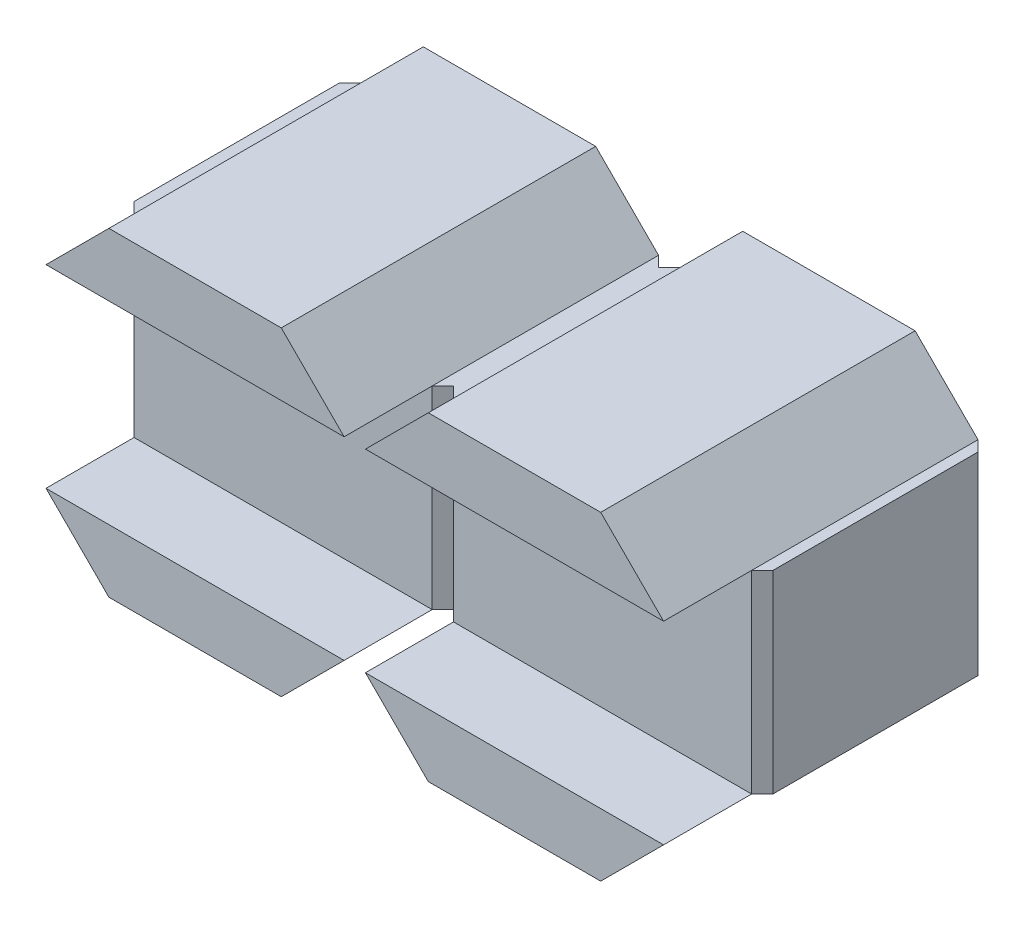
ISO-10303-21;
HEADER;
FILE_DESCRIPTION(('STEP AP214'),'2;1');
FILE_NAME('part.step','',(''),(''),'','','');
FILE_SCHEMA(('AUTOMOTIVE_DESIGN { 1 0 10303 214 1 1 1 1 }'));
ENDSEC;
DATA;
#1=APPLICATION_CONTEXT('core data for automotive mechanical design processes');
#2=APPLICATION_PROTOCOL_DEFINITION('international standard','automotive_design',2000,#1);
#3=PRODUCT_CONTEXT('',#1,'mechanical');
#4=PRODUCT('Part','Part','',(#3));
#5=PRODUCT_RELATED_PRODUCT_CATEGORY('part','',(#4));
#6=PRODUCT_DEFINITION_FORMATION('','',#4);
#7=PRODUCT_DEFINITION_CONTEXT('part definition',#1,'design');
#8=PRODUCT_DEFINITION('design','',#6,#7);
#9=PRODUCT_DEFINITION_SHAPE('','',#8);
#10=(LENGTH_UNIT() NAMED_UNIT(*) SI_UNIT(.MILLI.,.METRE.));
#11=(NAMED_UNIT(*) PLANE_ANGLE_UNIT() SI_UNIT($,.RADIAN.));
#12=(NAMED_UNIT(*) SI_UNIT($,.STERADIAN.) SOLID_ANGLE_UNIT());
#13=UNCERTAINTY_MEASURE_WITH_UNIT(LENGTH_MEASURE(1.E-05),#10,'distance_accuracy_value','');
#14=(GEOMETRIC_REPRESENTATION_CONTEXT(3) GLOBAL_UNCERTAINTY_ASSIGNED_CONTEXT((#13)) GLOBAL_UNIT_ASSIGNED_CONTEXT((#10,
#11,#12)) REPRESENTATION_CONTEXT('',''));
#15=CARTESIAN_POINT('',(0.,0.,0.));
#16=DIRECTION('',(0.,0.,1.));
#17=DIRECTION('',(1.,0.,0.));
#18=AXIS2_PLACEMENT_3D('',#15,#16,#17);
#19=CARTESIAN_POINT('',(-20.88535524301,12.424140161371,49.055899999998));
#20=DIRECTION('',(0.,-1.,0.));
#21=DIRECTION('',(0.,0.,-1.));
#22=AXIS2_PLACEMENT_3D('',#19,#20,#21);
#23=PLANE('',#22);
#24=DIRECTION('',(0.707106781307637,0.,0.707106781065458));
#25=VECTOR('',#24,1.);
#26=CARTESIAN_POINT('',(-20.88535524301,12.424140161371,47.255899999974));
#27=LINE('',#26,#25);
#28=CARTESIAN_POINT('',(-20.88535524301,12.424140161371,47.255899999987));
#29=VERTEX_POINT('',#28);
#30=CARTESIAN_POINT('',(-20.8006885763255,12.424140161371,47.3405666666285));
#31=VERTEX_POINT('',#30);
#32=EDGE_CURVE('E201',#29,#31,#27,.T.);
#33=ORIENTED_EDGE('',*,*,#32,.T.);
#34=DIRECTION('',(0.,0.,1.));
#35=VECTOR('',#34,1.);
#36=CARTESIAN_POINT('',(-20.80068857634,12.424140161371,48.155899999986));
#37=LINE('',#36,#35);
#38=CARTESIAN_POINT('',(-20.80068857634,12.424140161371,48.971233333344));
#39=VERTEX_POINT('',#38);
#40=EDGE_CURVE('E205',#31,#39,#37,.T.);
#41=ORIENTED_EDGE('',*,*,#40,.T.);
#42=DIRECTION('',(-0.707106781253365,0.,0.70710678111973));
#43=VECTOR('',#42,1.);
#44=CARTESIAN_POINT('',(-20.80068857634,12.424140161371,48.971233333344));
#45=LINE('',#44,#43);
#46=CARTESIAN_POINT('',(-20.885355243011,12.424140161371,49.055899999999));
#47=VERTEX_POINT('',#46);
#48=EDGE_CURVE('E21',#39,#47,#45,.T.);
#49=ORIENTED_EDGE('',*,*,#48,.T.);
#50=DIRECTION('',(0.,0.,1.));
#51=VECTOR('',#50,1.);
#52=CARTESIAN_POINT('',(-20.88535524301,12.424140161371,48.5059));
#53=LINE('',#52,#51);
#54=EDGE_CURVE('E418',#29,#47,#53,.T.);
#55=ORIENTED_EDGE('',*,*,#54,.F.);
#56=EDGE_LOOP('',(#33,#41,#49,#55));
#57=FACE_BOUND('',#56,.T.);
#58=ADVANCED_FACE('F17',(#57),#23,.T.);
#59=CARTESIAN_POINT('',(-21.38535524301,11.924140161371,49.7559));
#60=DIRECTION('',(0.70710678118655,-0.707106781186545,0.));
#61=DIRECTION('',(0.,0.,-1.));
#62=AXIS2_PLACEMENT_3D('',#59,#60,#61);
#63=PLANE('',#62);
#64=DIRECTION('',(0.707106781186545,0.70710678118655,0.));
#65=VECTOR('',#64,1.);
#66=CARTESIAN_POINT('',(-21.13535524301,12.174140161371,47.2559));
#67=LINE('',#66,#65);
#68=CARTESIAN_POINT('',(-21.38535524301,11.924140161371,47.2559));
#69=VERTEX_POINT('',#68);
#70=EDGE_CURVE('E221',#69,#29,#67,.T.);
#71=ORIENTED_EDGE('',*,*,#70,.T.);
#72=ORIENTED_EDGE('',*,*,#54,.T.);
#73=DIRECTION('',(0.,0.,1.));
#74=VECTOR('',#73,1.);
#75=CARTESIAN_POINT('',(-20.88535524301,12.424140161371,48.5059));
#76=LINE('',#75,#74);
#77=CARTESIAN_POINT('',(-20.88535524301,12.424140161371,49.7559));
#78=VERTEX_POINT('',#77);
#79=EDGE_CURVE('E214',#47,#78,#76,.T.);
#80=ORIENTED_EDGE('',*,*,#79,.T.);
#81=DIRECTION('',(-0.707106781186545,-0.70710678118655,0.));
#82=VECTOR('',#81,1.);
#83=CARTESIAN_POINT('',(-21.13535524301,12.174140161371,49.7559));
#84=LINE('',#83,#82);
#85=CARTESIAN_POINT('',(-21.38535524301,11.924140161371,49.7559));
#86=VERTEX_POINT('',#85);
#87=EDGE_CURVE('E217',#78,#86,#84,.T.);
#88=ORIENTED_EDGE('',*,*,#87,.T.);
#89=DIRECTION('',(0.,0.,1.));
#90=VECTOR('',#89,1.);
#91=CARTESIAN_POINT('',(-21.38535524301,11.924140161371,48.5059));
#92=LINE('',#91,#90);
#93=EDGE_CURVE('E290',#69,#86,#92,.T.);
#94=ORIENTED_EDGE('',*,*,#93,.F.);
#95=EDGE_LOOP('',(#71,#72,#80,#88,#94));
#96=FACE_BOUND('',#95,.T.);
#97=ADVANCED_FACE('F425',(#96),#63,.T.);
#98=CARTESIAN_POINT('',(-22.75602190967,11.924140161371,49.7559));
#99=DIRECTION('',(0.,-1.,0.));
#100=DIRECTION('',(0.,0.,-1.));
#101=AXIS2_PLACEMENT_3D('',#98,#99,#100);
#102=PLANE('',#101);
#103=DIRECTION('',(1.,0.,0.));
#104=VECTOR('',#103,1.);
#105=CARTESIAN_POINT('',(-22.07068857634,11.924140161371,47.2559));
#106=LINE('',#105,#104);
#107=CARTESIAN_POINT('',(-22.75602190967,11.924140161371,47.2559));
#108=VERTEX_POINT('',#107);
#109=EDGE_CURVE('E413',#108,#69,#106,.T.);
#110=ORIENTED_EDGE('',*,*,#109,.T.);
#111=ORIENTED_EDGE('',*,*,#93,.T.);
#112=DIRECTION('',(-1.,0.,0.));
#113=VECTOR('',#112,1.);
#114=CARTESIAN_POINT('',(-22.07068857634,11.924140161371,49.7559));
#115=LINE('',#114,#113);
#116=CARTESIAN_POINT('',(-22.75602190967,11.924140161371,49.7559));
#117=VERTEX_POINT('',#116);
#118=EDGE_CURVE('E416',#86,#117,#115,.T.);
#119=ORIENTED_EDGE('',*,*,#118,.T.);
#120=DIRECTION('',(0.,0.,1.));
#121=VECTOR('',#120,1.);
#122=CARTESIAN_POINT('',(-22.75602190967,11.924140161371,48.5059));
#123=LINE('',#122,#121);
#124=EDGE_CURVE('E277',#108,#117,#123,.T.);
#125=ORIENTED_EDGE('',*,*,#124,.F.);
#126=EDGE_LOOP('',(#110,#111,#119,#125));
#127=FACE_BOUND('',#126,.T.);
#128=ADVANCED_FACE('F521',(#127),#102,.T.);
#129=CARTESIAN_POINT('',(-22.75602190967,11.924140161371,47.2559));
#130=DIRECTION('',(-0.707106781186547,-0.707106781186547,0.));
#131=DIRECTION('',(0.,0.,1.));
#132=AXIS2_PLACEMENT_3D('',#129,#130,#131);
#133=PLANE('',#132);
#134=ORIENTED_EDGE('',*,*,#124,.T.);
#135=DIRECTION('',(-0.707106781186547,0.707106781186547,0.));
#136=VECTOR('',#135,1.);
#137=CARTESIAN_POINT('',(-23.00602190967,12.174140161371,49.7559));
#138=LINE('',#137,#136);
#139=CARTESIAN_POINT('',(-23.25602190967,12.424140161371,49.7559));
#140=VERTEX_POINT('',#139);
#141=EDGE_CURVE('E399',#117,#140,#138,.T.);
#142=ORIENTED_EDGE('',*,*,#141,.T.);
#143=DIRECTION('',(0.,0.,-1.));
#144=VECTOR('',#143,1.);
#145=CARTESIAN_POINT('',(-23.25602190967,12.424140161371,48.5059));
#146=LINE('',#145,#144);
#147=CARTESIAN_POINT('',(-23.25602190967,12.424140161371,49.0558999999998));
#148=VERTEX_POINT('',#147);
#149=EDGE_CURVE('E278',#140,#148,#146,.T.);
#150=ORIENTED_EDGE('',*,*,#149,.T.);
#151=DIRECTION('',(0.,0.,1.));
#152=VECTOR('',#151,1.);
#153=CARTESIAN_POINT('',(-23.25602190967,12.424140161371,48.155899999979));
#154=LINE('',#153,#152);
#155=CARTESIAN_POINT('',(-23.256021909695,12.424140161396,47.2558999999895));
#156=VERTEX_POINT('',#155);
#157=EDGE_CURVE('E265',#156,#148,#154,.T.);
#158=ORIENTED_EDGE('',*,*,#157,.F.);
#159=DIRECTION('',(0.707106781186547,-0.707106781186547,0.));
#160=VECTOR('',#159,1.);
#161=CARTESIAN_POINT('',(-23.00602190967,12.174140161371,47.2559));
#162=LINE('',#161,#160);
#163=EDGE_CURVE('E274',#156,#108,#162,.T.);
#164=ORIENTED_EDGE('',*,*,#163,.T.);
#165=EDGE_LOOP('',(#134,#142,#150,#158,#164));
#166=FACE_BOUND('',#165,.T.);
#167=ADVANCED_FACE('F513',(#166),#133,.T.);
#168=CARTESIAN_POINT('',(-25.88068857634,12.424140161371,49.0559));
#169=DIRECTION('',(0.,-1.,0.));
#170=DIRECTION('',(0.,0.,-1.));
#171=AXIS2_PLACEMENT_3D('',#168,#169,#170);
#172=PLANE('',#171);
#173=DIRECTION('',(0.70710678144543,0.,-0.707106780927665));
#174=VECTOR('',#173,1.);
#175=CARTESIAN_POINT('',(-25.88068857634,12.424140161371,47.340566666566));
#176=LINE('',#175,#174);
#177=CARTESIAN_POINT('',(-25.88068857634,12.424140161371,47.340566666566));
#178=VERTEX_POINT('',#177);
#179=CARTESIAN_POINT('',(-25.79602190967,12.424140161371,47.255899999979));
#180=VERTEX_POINT('',#179);
#181=EDGE_CURVE('E243',#178,#180,#176,.T.);
#182=ORIENTED_EDGE('',*,*,#181,.T.);
#183=DIRECTION('',(0.,0.,-1.));
#184=VECTOR('',#183,1.);
#185=CARTESIAN_POINT('',(-25.79602190967,12.424140161371,48.5059));
#186=LINE('',#185,#184);
#187=CARTESIAN_POINT('',(-25.79602190967,12.424140161371,49.0558999999998));
#188=VERTEX_POINT('',#187);
#189=EDGE_CURVE('E248',#188,#180,#186,.T.);
#190=ORIENTED_EDGE('',*,*,#189,.F.);
#191=DIRECTION('',(-0.707106781203252,0.,-0.707106781169843));
#192=VECTOR('',#191,1.);
#193=CARTESIAN_POINT('',(-25.79602190967,12.424140161371,49.0559));
#194=LINE('',#193,#192);
#195=CARTESIAN_POINT('',(-25.88068857634,12.424140161371,48.971233333334));
#196=VERTEX_POINT('',#195);
#197=EDGE_CURVE('E244',#188,#196,#194,.T.);
#198=ORIENTED_EDGE('',*,*,#197,.T.);
#199=DIRECTION('',(0.,0.,-1.));
#200=VECTOR('',#199,1.);
#201=CARTESIAN_POINT('',(-25.88068857634,12.424140161371,48.155899999979));
#202=LINE('',#201,#200);
#203=EDGE_CURVE('E240',#196,#178,#202,.T.);
#204=ORIENTED_EDGE('',*,*,#203,.T.);
#205=EDGE_LOOP('',(#182,#190,#198,#204));
#206=FACE_BOUND('',#205,.T.);
#207=ADVANCED_FACE('F529',(#206),#172,.T.);
#208=CARTESIAN_POINT('',(-23.42535524301,12.424140161371,49.0559));
#209=DIRECTION('',(0.,-1.,0.));
#210=DIRECTION('',(0.,0.,-1.));
#211=AXIS2_PLACEMENT_3D('',#208,#209,#210);
#212=PLANE('',#211);
#213=DIRECTION('',(0.707106781240819,0.,-0.707106781132276));
#214=VECTOR('',#213,1.);
#215=CARTESIAN_POINT('',(-23.34068857634,12.424140161371,47.340566666615));
#216=LINE('',#215,#214);
#217=CARTESIAN_POINT('',(-23.34068857634,12.424140161371,47.340566666615));
#218=VERTEX_POINT('',#217);
#219=EDGE_CURVE('E285',#218,#156,#216,.T.);
#220=ORIENTED_EDGE('',*,*,#219,.T.);
#221=ORIENTED_EDGE('',*,*,#157,.T.);
#222=DIRECTION('',(-0.707106781245049,0.,-0.707106781128046));
#223=VECTOR('',#222,1.);
#224=CARTESIAN_POINT('',(-23.25602190967,12.424140161371,49.0559));
#225=LINE('',#224,#223);
#226=CARTESIAN_POINT('',(-23.3406885763356,12.424140161371,48.9712333333409));
#227=VERTEX_POINT('',#226);
#228=EDGE_CURVE('E394',#148,#227,#225,.T.);
#229=ORIENTED_EDGE('',*,*,#228,.T.);
#230=DIRECTION('',(-0.707106781245035,0.,0.70710678112806));
#231=VECTOR('',#230,1.);
#232=CARTESIAN_POINT('',(-23.34068857634,12.424140161371,48.971233333344));
#233=LINE('',#232,#231);
#234=CARTESIAN_POINT('',(-23.42535524301,12.424140161371,49.0558999999995));
#235=VERTEX_POINT('',#234);
#236=EDGE_CURVE('E391',#227,#235,#233,.T.);
#237=ORIENTED_EDGE('',*,*,#236,.T.);
#238=DIRECTION('',(0.,0.,1.));
#239=VECTOR('',#238,1.);
#240=CARTESIAN_POINT('',(-23.42535524301,12.424140161371,48.5059));
#241=LINE('',#240,#239);
#242=CARTESIAN_POINT('',(-23.42535524301,12.424140161371,47.255899999979));
#243=VERTEX_POINT('',#242);
#244=EDGE_CURVE('E304',#243,#235,#241,.T.);
#245=ORIENTED_EDGE('',*,*,#244,.F.);
#246=DIRECTION('',(0.707106781240804,0.,0.707106781132291));
#247=VECTOR('',#246,1.);
#248=CARTESIAN_POINT('',(-23.42535524301,12.424140161371,47.255899999958));
#249=LINE('',#248,#247);
#250=EDGE_CURVE('E388',#243,#218,#249,.T.);
#251=ORIENTED_EDGE('',*,*,#250,.T.);
#252=EDGE_LOOP('',(#220,#221,#229,#237,#245,#251));
#253=FACE_BOUND('',#252,.T.);
#254=ADVANCED_FACE('F478',(#253),#212,.T.);
#255=CARTESIAN_POINT('',(-25.29602190967,11.924140161371,47.2559));
#256=DIRECTION('',(-0.707106781186547,-0.707106781186547,0.));
#257=DIRECTION('',(0.,0.,1.));
#258=AXIS2_PLACEMENT_3D('',#255,#256,#257);
#259=PLANE('',#258);
#260=DIRECTION('',(0.,0.,-1.));
#261=VECTOR('',#260,1.);
#262=CARTESIAN_POINT('',(-25.29602190967,11.924140161371,48.5059));
#263=LINE('',#262,#261);
#264=CARTESIAN_POINT('',(-25.29602190967,11.924140161371,49.7559));
#265=VERTEX_POINT('',#264);
#266=CARTESIAN_POINT('',(-25.29602190967,11.924140161371,47.2559));
#267=VERTEX_POINT('',#266);
#268=EDGE_CURVE('E307',#265,#267,#263,.T.);
#269=ORIENTED_EDGE('',*,*,#268,.F.);
#270=DIRECTION('',(-0.707106781186547,0.707106781186547,0.));
#271=VECTOR('',#270,1.);
#272=CARTESIAN_POINT('',(-25.54602190967,12.174140161371,49.7559));
#273=LINE('',#272,#271);
#274=CARTESIAN_POINT('',(-25.79602190967,12.424140161371,49.7559));
#275=VERTEX_POINT('',#274);
#276=EDGE_CURVE('E247',#265,#275,#273,.T.);
#277=ORIENTED_EDGE('',*,*,#276,.T.);
#278=DIRECTION('',(0.,0.,-1.));
#279=VECTOR('',#278,1.);
#280=CARTESIAN_POINT('',(-25.79602190967,12.424140161371,48.5059));
#281=LINE('',#280,#279);
#282=EDGE_CURVE('E254',#275,#188,#281,.T.);
#283=ORIENTED_EDGE('',*,*,#282,.T.);
#284=ORIENTED_EDGE('',*,*,#189,.T.);
#285=DIRECTION('',(0.707106781186547,-0.707106781186547,0.));
#286=VECTOR('',#285,1.);
#287=CARTESIAN_POINT('',(-25.54602190967,12.174140161371,47.2559));
#288=LINE('',#287,#286);
#289=EDGE_CURVE('E245',#180,#267,#288,.T.);
#290=ORIENTED_EDGE('',*,*,#289,.T.);
#291=EDGE_LOOP('',(#269,#277,#283,#284,#290));
#292=FACE_BOUND('',#291,.T.);
#293=ADVANCED_FACE('F471',(#292),#259,.T.);
#294=CARTESIAN_POINT('',(-23.92535524301,11.924140161371,49.7559));
#295=DIRECTION('',(0.707106781186547,-0.707106781186547,0.));
#296=DIRECTION('',(0.,0.,-1.));
#297=AXIS2_PLACEMENT_3D('',#294,#295,#296);
#298=PLANE('',#297);
#299=DIRECTION('',(0.707106781186547,0.707106781186547,0.));
#300=VECTOR('',#299,1.);
#301=CARTESIAN_POINT('',(-23.67535524301,12.174140161371,47.2559));
#302=LINE('',#301,#300);
#303=CARTESIAN_POINT('',(-23.92535524301,11.924140161371,47.2559));
#304=VERTEX_POINT('',#303);
#305=EDGE_CURVE('E308',#304,#243,#302,.T.);
#306=ORIENTED_EDGE('',*,*,#305,.T.);
#307=ORIENTED_EDGE('',*,*,#244,.T.);
#308=DIRECTION('',(0.,0.,1.));
#309=VECTOR('',#308,1.);
#310=CARTESIAN_POINT('',(-23.42535524301,12.424140161371,48.5059));
#311=LINE('',#310,#309);
#312=CARTESIAN_POINT('',(-23.42535524301,12.424140161371,49.7559));
#313=VERTEX_POINT('',#312);
#314=EDGE_CURVE('E295',#235,#313,#311,.T.);
#315=ORIENTED_EDGE('',*,*,#314,.T.);
#316=DIRECTION('',(-0.707106781186547,-0.707106781186547,0.));
#317=VECTOR('',#316,1.);
#318=CARTESIAN_POINT('',(-23.67535524301,12.174140161371,49.7559));
#319=LINE('',#318,#317);
#320=CARTESIAN_POINT('',(-23.92535524301,11.924140161371,49.7559));
#321=VERTEX_POINT('',#320);
#322=EDGE_CURVE('E298',#313,#321,#319,.T.);
#323=ORIENTED_EDGE('',*,*,#322,.T.);
#324=DIRECTION('',(0.,0.,1.));
#325=VECTOR('',#324,1.);
#326=CARTESIAN_POINT('',(-23.92535524301,11.924140161371,48.5059));
#327=LINE('',#326,#325);
#328=EDGE_CURVE('E385',#304,#321,#327,.T.);
#329=ORIENTED_EDGE('',*,*,#328,.F.);
#330=EDGE_LOOP('',(#306,#307,#315,#323,#329));
#331=FACE_BOUND('',#330,.T.);
#332=ADVANCED_FACE('F460',(#331),#298,.T.);
#333=CARTESIAN_POINT('',(-25.29602190967,11.924140161371,49.7559));
#334=DIRECTION('',(0.,-1.,0.));
#335=DIRECTION('',(0.,0.,-1.));
#336=AXIS2_PLACEMENT_3D('',#333,#334,#335);
#337=PLANE('',#336);
#338=DIRECTION('',(1.,0.,0.));
#339=VECTOR('',#338,1.);
#340=CARTESIAN_POINT('',(-24.61068857634,11.924140161371,47.2559));
#341=LINE('',#340,#339);
#342=EDGE_CURVE('E454',#267,#304,#341,.T.);
#343=ORIENTED_EDGE('',*,*,#342,.T.);
#344=ORIENTED_EDGE('',*,*,#328,.T.);
#345=DIRECTION('',(-1.,0.,0.));
#346=VECTOR('',#345,1.);
#347=CARTESIAN_POINT('',(-24.61068857634,11.924140161371,49.7559));
#348=LINE('',#347,#346);
#349=EDGE_CURVE('E326',#321,#265,#348,.T.);
#350=ORIENTED_EDGE('',*,*,#349,.T.);
#351=ORIENTED_EDGE('',*,*,#268,.T.);
#352=EDGE_LOOP('',(#343,#344,#350,#351));
#353=FACE_BOUND('',#352,.T.);
#354=ADVANCED_FACE('F465',(#353),#337,.T.);
#355=CARTESIAN_POINT('',(-23.42535524301,13.964140161371,49.7559));
#356=DIRECTION('',(0.,0.,-1.));
#357=DIRECTION('',(-1.,0.,0.));
#358=AXIS2_PLACEMENT_3D('',#355,#356,#357);
#359=PLANE('',#358);
#360=DIRECTION('',(-0.707106781186549,0.707106781186546,0.));
#361=VECTOR('',#360,1.);
#362=CARTESIAN_POINT('',(-23.42535524301,13.964140161371,49.7559));
#363=LINE('',#362,#361);
#364=CARTESIAN_POINT('',(-23.92535524301,14.464140161371,49.7559));
#365=VERTEX_POINT('',#364);
#366=CARTESIAN_POINT('',(-23.42535524301,13.964140161371,49.7559));
#367=VERTEX_POINT('',#366);
#368=EDGE_CURVE('E316',#365,#367,#363,.F.);
#369=ORIENTED_EDGE('',*,*,#368,.F.);
#370=DIRECTION('',(1.,0.,0.));
#371=VECTOR('',#370,1.);
#372=CARTESIAN_POINT('',(-24.61068857634,14.464140161371,49.7559));
#373=LINE('',#372,#371);
#374=CARTESIAN_POINT('',(-25.29602190967,14.464140161371,49.7559));
#375=VERTEX_POINT('',#374);
#376=EDGE_CURVE('E314',#375,#365,#373,.T.);
#377=ORIENTED_EDGE('',*,*,#376,.F.);
#378=DIRECTION('',(0.707106781186549,0.707106781186546,0.));
#379=VECTOR('',#378,1.);
#380=CARTESIAN_POINT('',(-25.79602190967,13.964140161371,49.7559));
#381=LINE('',#380,#379);
#382=CARTESIAN_POINT('',(-25.79602190967,13.964140161371,49.7559));
#383=VERTEX_POINT('',#382);
#384=EDGE_CURVE('E317',#383,#375,#381,.T.);
#385=ORIENTED_EDGE('',*,*,#384,.F.);
#386=DIRECTION('',(-1.,0.,0.));
#387=VECTOR('',#386,1.);
#388=CARTESIAN_POINT('',(-24.61068857634,13.964140161371,49.7559));
#389=LINE('',#388,#387);
#390=EDGE_CURVE('E319',#367,#383,#389,.T.);
#391=ORIENTED_EDGE('',*,*,#390,.F.);
#392=EDGE_LOOP('',(#369,#377,#385,#391));
#393=FACE_BOUND('',#392,.T.);
#394=ADVANCED_FACE('F619',(#393),#359,.F.);
#395=CARTESIAN_POINT('',(-23.42535524301,11.924140161371,49.7559));
#396=DIRECTION('',(0.,0.,-1.));
#397=DIRECTION('',(-1.,0.,0.));
#398=AXIS2_PLACEMENT_3D('',#395,#396,#397);
#399=PLANE('',#398);
#400=ORIENTED_EDGE('',*,*,#276,.F.);
#401=ORIENTED_EDGE('',*,*,#349,.F.);
#402=ORIENTED_EDGE('',*,*,#322,.F.);
#403=DIRECTION('',(-1.,0.,0.));
#404=VECTOR('',#403,1.);
#405=CARTESIAN_POINT('',(-24.61068857634,12.424140161371,49.7559));
#406=LINE('',#405,#404);
#407=EDGE_CURVE('E328',#313,#275,#406,.T.);
#408=ORIENTED_EDGE('',*,*,#407,.T.);
#409=EDGE_LOOP('',(#400,#401,#402,#408));
#410=FACE_BOUND('',#409,.T.);
#411=ADVANCED_FACE('F467',(#410),#399,.F.);
#412=CARTESIAN_POINT('',(-25.79602190967,13.964140161371,49.7559));
#413=DIRECTION('',(0.,-1.,0.));
#414=DIRECTION('',(0.,0.,-1.));
#415=AXIS2_PLACEMENT_3D('',#412,#413,#414);
#416=PLANE('',#415);
#417=DIRECTION('',(0.,0.,-1.));
#418=VECTOR('',#417,1.);
#419=CARTESIAN_POINT('',(-25.79602190967,13.964140161371,49.4058999999995));
#420=LINE('',#419,#418);
#421=CARTESIAN_POINT('',(-25.79602190967,13.964140161371,49.0558999999998));
#422=VERTEX_POINT('',#421);
#423=EDGE_CURVE('E322',#383,#422,#420,.T.);
#424=ORIENTED_EDGE('',*,*,#423,.T.);
#425=DIRECTION('',(1.,0.,0.));
#426=VECTOR('',#425,1.);
#427=CARTESIAN_POINT('',(-24.61068857634,13.964140161371,49.0559));
#428=LINE('',#427,#426);
#429=CARTESIAN_POINT('',(-23.42535524301,13.964140161371,49.0558999999994));
#430=VERTEX_POINT('',#429);
#431=EDGE_CURVE('E262',#422,#430,#428,.T.);
#432=ORIENTED_EDGE('',*,*,#431,.T.);
#433=DIRECTION('',(0.,0.,1.));
#434=VECTOR('',#433,1.);
#435=CARTESIAN_POINT('',(-23.42535524301,13.964140161371,49.4058999999995));
#436=LINE('',#435,#434);
#437=EDGE_CURVE('E323',#430,#367,#436,.T.);
#438=ORIENTED_EDGE('',*,*,#437,.T.);
#439=ORIENTED_EDGE('',*,*,#390,.T.);
#440=EDGE_LOOP('',(#424,#432,#438,#439));
#441=FACE_BOUND('',#440,.T.);
#442=ADVANCED_FACE('F612',(#441),#416,.T.);
#443=CARTESIAN_POINT('',(-25.79602190967,12.424140161371,49.7559));
#444=DIRECTION('',(0.,-1.,0.));
#445=DIRECTION('',(0.,0.,-1.));
#446=AXIS2_PLACEMENT_3D('',#443,#444,#445);
#447=PLANE('',#446);
#448=DIRECTION('',(-1.,0.,0.));
#449=VECTOR('',#448,1.);
#450=CARTESIAN_POINT('',(-24.61068857634,12.424140161371,49.0559));
#451=LINE('',#450,#449);
#452=EDGE_CURVE('E259',#235,#188,#451,.T.);
#453=ORIENTED_EDGE('',*,*,#452,.T.);
#454=ORIENTED_EDGE('',*,*,#282,.F.);
#455=ORIENTED_EDGE('',*,*,#407,.F.);
#456=ORIENTED_EDGE('',*,*,#314,.F.);
#457=EDGE_LOOP('',(#453,#454,#455,#456));
#458=FACE_BOUND('',#457,.T.);
#459=ADVANCED_FACE('F608',(#458),#447,.F.);
#460=CARTESIAN_POINT('',(-23.42535524301,12.424140161371,49.0559));
#461=DIRECTION('',(0.,0.,-1.));
#462=DIRECTION('',(-1.,0.,0.));
#463=AXIS2_PLACEMENT_3D('',#460,#461,#462);
#464=PLANE('',#463);
#465=ORIENTED_EDGE('',*,*,#452,.F.);
#466=DIRECTION('',(0.,1.,0.));
#467=VECTOR('',#466,1.);
#468=CARTESIAN_POINT('',(-23.42535524301,13.194140161371,49.0559));
#469=LINE('',#468,#467);
#470=EDGE_CURVE('E299',#235,#430,#469,.T.);
#471=ORIENTED_EDGE('',*,*,#470,.T.);
#472=ORIENTED_EDGE('',*,*,#431,.F.);
#473=DIRECTION('',(0.,1.,0.));
#474=VECTOR('',#473,1.);
#475=CARTESIAN_POINT('',(-25.79602190967,13.194140161371,49.0559));
#476=LINE('',#475,#474);
#477=EDGE_CURVE('E255',#188,#422,#476,.T.);
#478=ORIENTED_EDGE('',*,*,#477,.F.);
#479=EDGE_LOOP('',(#465,#471,#472,#478));
#480=FACE_BOUND('',#479,.T.);
#481=ADVANCED_FACE('F605',(#480),#464,.F.);
#482=CARTESIAN_POINT('',(-20.88535524301,13.964140161371,49.7559));
#483=DIRECTION('',(0.,0.,-1.));
#484=DIRECTION('',(-1.,0.,0.));
#485=AXIS2_PLACEMENT_3D('',#482,#483,#484);
#486=PLANE('',#485);
#487=DIRECTION('',(-0.707106781186546,0.707106781186549,0.));
#488=VECTOR('',#487,1.);
#489=CARTESIAN_POINT('',(-20.88535524301,13.964140161371,49.7559));
#490=LINE('',#489,#488);
#491=CARTESIAN_POINT('',(-21.38535524301,14.464140161371,49.7559));
#492=VERTEX_POINT('',#491);
#493=CARTESIAN_POINT('',(-20.88535524301,13.964140161371,49.7559));
#494=VERTEX_POINT('',#493);
#495=EDGE_CURVE('E303',#492,#494,#490,.F.);
#496=ORIENTED_EDGE('',*,*,#495,.F.);
#497=DIRECTION('',(1.,0.,0.));
#498=VECTOR('',#497,1.);
#499=CARTESIAN_POINT('',(-22.07068857634,14.464140161371,49.7559));
#500=LINE('',#499,#498);
#501=CARTESIAN_POINT('',(-22.75602190967,14.464140161371,49.7559));
#502=VERTEX_POINT('',#501);
#503=EDGE_CURVE('E331',#502,#492,#500,.T.);
#504=ORIENTED_EDGE('',*,*,#503,.F.);
#505=DIRECTION('',(0.707106781186549,0.707106781186546,0.));
#506=VECTOR('',#505,1.);
#507=CARTESIAN_POINT('',(-23.25602190967,13.964140161371,49.7559));
#508=LINE('',#507,#506);
#509=CARTESIAN_POINT('',(-23.25602190967,13.964140161371,49.7559));
#510=VERTEX_POINT('',#509);
#511=EDGE_CURVE('E258',#510,#502,#508,.T.);
#512=ORIENTED_EDGE('',*,*,#511,.F.);
#513=DIRECTION('',(-1.,0.,0.));
#514=VECTOR('',#513,1.);
#515=CARTESIAN_POINT('',(-22.07068857634,13.964140161371,49.7559));
#516=LINE('',#515,#514);
#517=EDGE_CURVE('E335',#494,#510,#516,.T.);
#518=ORIENTED_EDGE('',*,*,#517,.F.);
#519=EDGE_LOOP('',(#496,#504,#512,#518));
#520=FACE_BOUND('',#519,.T.);
#521=ADVANCED_FACE('F503',(#520),#486,.F.);
#522=CARTESIAN_POINT('',(-20.88535524301,11.924140161371,49.7559));
#523=DIRECTION('',(0.,0.,-1.));
#524=DIRECTION('',(-1.,0.,0.));
#525=AXIS2_PLACEMENT_3D('',#522,#523,#524);
#526=PLANE('',#525);
#527=ORIENTED_EDGE('',*,*,#141,.F.);
#528=ORIENTED_EDGE('',*,*,#118,.F.);
#529=ORIENTED_EDGE('',*,*,#87,.F.);
#530=DIRECTION('',(-1.,0.,0.));
#531=VECTOR('',#530,1.);
#532=CARTESIAN_POINT('',(-22.07068857634,12.424140161371,49.7559));
#533=LINE('',#532,#531);
#534=EDGE_CURVE('E342',#78,#140,#533,.T.);
#535=ORIENTED_EDGE('',*,*,#534,.T.);
#536=EDGE_LOOP('',(#527,#528,#529,#535));
#537=FACE_BOUND('',#536,.T.);
#538=ADVANCED_FACE('F519',(#537),#526,.F.);
#539=CARTESIAN_POINT('',(-23.34068857634,12.424140161371,48.971233333344));
#540=DIRECTION('',(-0.707106781128089,0.,-0.707106781245006));
#541=DIRECTION('',(-0.707106781245006,0.,0.707106781128089));
#542=AXIS2_PLACEMENT_3D('',#539,#540,#541);
#543=PLANE('',#542);
#544=DIRECTION('',(0.707106781245006,0.,-0.707106781128089));
#545=VECTOR('',#544,1.);
#546=CARTESIAN_POINT('',(-23.383021909675,13.964140161371,49.013566666672));
#547=LINE('',#546,#545);
#548=CARTESIAN_POINT('',(-23.3406885761607,13.964140161371,48.9712333335195));
#549=VERTEX_POINT('',#548);
#550=EDGE_CURVE('E302',#430,#549,#547,.T.);
#551=ORIENTED_EDGE('',*,*,#550,.F.);
#552=ORIENTED_EDGE('',*,*,#470,.F.);
#553=ORIENTED_EDGE('',*,*,#236,.F.);
#554=DIRECTION('',(0.,1.,0.));
#555=VECTOR('',#554,1.);
#556=CARTESIAN_POINT('',(-23.34068857633,13.194140161371,48.971233333339));
#557=LINE('',#556,#555);
#558=EDGE_CURVE('E291',#227,#549,#557,.T.);
#559=ORIENTED_EDGE('',*,*,#558,.T.);
#560=EDGE_LOOP('',(#551,#552,#553,#559));
#561=FACE_BOUND('',#560,.T.);
#562=ADVANCED_FACE('F483',(#561),#543,.F.);
#563=CARTESIAN_POINT('',(-23.25602190967,13.964140161371,49.7559));
#564=DIRECTION('',(0.,-1.,0.));
#565=DIRECTION('',(0.,0.,-1.));
#566=AXIS2_PLACEMENT_3D('',#563,#564,#565);
#567=PLANE('',#566);
#568=DIRECTION('',(1.,0.,0.));
#569=VECTOR('',#568,1.);
#570=CARTESIAN_POINT('',(-22.07068857634,13.964140161371,49.0559));
#571=LINE('',#570,#569);
#572=CARTESIAN_POINT('',(-23.25602190967,13.964140161371,49.0558999999998));
#573=VERTEX_POINT('',#572);
#574=CARTESIAN_POINT('',(-20.88535524301,13.964140161371,49.0558999999994));
#575=VERTEX_POINT('',#574);
#576=EDGE_CURVE('E234',#573,#575,#571,.T.);
#577=ORIENTED_EDGE('',*,*,#576,.T.);
#578=DIRECTION('',(0.,0.,1.));
#579=VECTOR('',#578,1.);
#580=CARTESIAN_POINT('',(-20.88535524301,13.964140161371,49.4058999999995));
#581=LINE('',#580,#579);
#582=EDGE_CURVE('E339',#575,#494,#581,.T.);
#583=ORIENTED_EDGE('',*,*,#582,.T.);
#584=ORIENTED_EDGE('',*,*,#517,.T.);
#585=DIRECTION('',(0.,0.,-1.));
#586=VECTOR('',#585,1.);
#587=CARTESIAN_POINT('',(-23.25602190967,13.964140161371,49.4058999999995));
#588=LINE('',#587,#586);
#589=EDGE_CURVE('E338',#510,#573,#588,.T.);
#590=ORIENTED_EDGE('',*,*,#589,.T.);
#591=EDGE_LOOP('',(#577,#583,#584,#590));
#592=FACE_BOUND('',#591,.T.);
#593=ADVANCED_FACE('F499',(#592),#567,.T.);
#594=CARTESIAN_POINT('',(-23.25602190967,12.424140161371,49.7559));
#595=DIRECTION('',(0.,-1.,0.));
#596=DIRECTION('',(0.,0.,-1.));
#597=AXIS2_PLACEMENT_3D('',#594,#595,#596);
#598=PLANE('',#597);
#599=ORIENTED_EDGE('',*,*,#534,.F.);
#600=ORIENTED_EDGE('',*,*,#79,.F.);
#601=DIRECTION('',(-1.,0.,0.));
#602=VECTOR('',#601,1.);
#603=CARTESIAN_POINT('',(-22.07068857634,12.424140161371,49.0559));
#604=LINE('',#603,#602);
#605=EDGE_CURVE('E230',#47,#148,#604,.T.);
#606=ORIENTED_EDGE('',*,*,#605,.T.);
#607=ORIENTED_EDGE('',*,*,#149,.F.);
#608=EDGE_LOOP('',(#599,#600,#606,#607));
#609=FACE_BOUND('',#608,.T.);
#610=ADVANCED_FACE('F516',(#609),#598,.F.);
#611=CARTESIAN_POINT('',(-23.25602190967,12.424140161371,49.0559));
#612=DIRECTION('',(0.707106781190735,0.,-0.707106781182361));
#613=DIRECTION('',(-0.70710678118236,0.,-0.707106781190734));
#614=AXIS2_PLACEMENT_3D('',#611,#612,#613);
#615=PLANE('',#614);
#616=ORIENTED_EDGE('',*,*,#228,.F.);
#617=DIRECTION('',(0.,1.,0.));
#618=VECTOR('',#617,1.);
#619=CARTESIAN_POINT('',(-23.25602190967,13.194140161371,49.0559));
#620=LINE('',#619,#618);
#621=EDGE_CURVE('E233',#148,#573,#620,.T.);
#622=ORIENTED_EDGE('',*,*,#621,.T.);
#623=DIRECTION('',(0.70710678118236,0.,0.707106781190734));
#624=VECTOR('',#623,1.);
#625=CARTESIAN_POINT('',(-23.298355243,13.964140161371,49.0135666666695));
#626=LINE('',#625,#624);
#627=EDGE_CURVE('E294',#549,#573,#626,.T.);
#628=ORIENTED_EDGE('',*,*,#627,.F.);
#629=ORIENTED_EDGE('',*,*,#558,.F.);
#630=EDGE_LOOP('',(#616,#622,#628,#629));
#631=FACE_BOUND('',#630,.T.);
#632=ADVANCED_FACE('F487',(#631),#615,.F.);
#633=CARTESIAN_POINT('',(-20.88535524301,12.424140161371,49.0559));
#634=DIRECTION('',(0.,0.,-1.));
#635=DIRECTION('',(-1.,0.,0.));
#636=AXIS2_PLACEMENT_3D('',#633,#634,#635);
#637=PLANE('',#636);
#638=ORIENTED_EDGE('',*,*,#605,.F.);
#639=DIRECTION('',(0.,1.,0.));
#640=VECTOR('',#639,1.);
#641=CARTESIAN_POINT('',(-20.88535524301,13.194140161371,49.0559));
#642=LINE('',#641,#640);
#643=EDGE_CURVE('E195',#47,#575,#642,.T.);
#644=ORIENTED_EDGE('',*,*,#643,.T.);
#645=ORIENTED_EDGE('',*,*,#576,.F.);
#646=ORIENTED_EDGE('',*,*,#621,.F.);
#647=EDGE_LOOP('',(#638,#644,#645,#646));
#648=FACE_BOUND('',#647,.T.);
#649=ADVANCED_FACE('F589',(#648),#637,.F.);
#650=CARTESIAN_POINT('',(-20.88535524301,13.964140161371,47.255899999974));
#651=DIRECTION('',(0.,1.,0.));
#652=DIRECTION('',(0.,0.,1.));
#653=AXIS2_PLACEMENT_3D('',#650,#651,#652);
#654=PLANE('',#653);
#655=DIRECTION('',(-0.707106781090493,0.,-0.707106781282602));
#656=VECTOR('',#655,1.);
#657=CARTESIAN_POINT('',(-20.80068857634,13.964140161371,47.340566666667));
#658=LINE('',#657,#656);
#659=CARTESIAN_POINT('',(-20.8006885763325,13.964140161371,47.340566666654));
#660=VERTEX_POINT('',#659);
#661=CARTESIAN_POINT('',(-20.88535524301,13.964140161371,47.255899999987));
#662=VERTEX_POINT('',#661);
#663=EDGE_CURVE('E229',#660,#662,#658,.T.);
#664=ORIENTED_EDGE('',*,*,#663,.T.);
#665=DIRECTION('',(0.,0.,-1.));
#666=VECTOR('',#665,1.);
#667=CARTESIAN_POINT('',(-20.88535524301,13.964140161371,48.5059));
#668=LINE('',#667,#666);
#669=EDGE_CURVE('E350',#575,#662,#668,.T.);
#670=ORIENTED_EDGE('',*,*,#669,.F.);
#671=DIRECTION('',(0.70710678124502,0.,-0.707106781128075));
#672=VECTOR('',#671,1.);
#673=CARTESIAN_POINT('',(-20.843021909675,13.964140161371,49.013566666672));
#674=LINE('',#673,#672);
#675=CARTESIAN_POINT('',(-20.80068857634,13.964140161371,48.971233333344));
#676=VERTEX_POINT('',#675);
#677=EDGE_CURVE('E228',#575,#676,#674,.T.);
#678=ORIENTED_EDGE('',*,*,#677,.T.);
#679=DIRECTION('',(0.,0.,-1.));
#680=VECTOR('',#679,1.);
#681=CARTESIAN_POINT('',(-20.80068857634,13.964140161371,48.1558999999865));
#682=LINE('',#681,#680);
#683=EDGE_CURVE('E208',#676,#660,#682,.T.);
#684=ORIENTED_EDGE('',*,*,#683,.T.);
#685=EDGE_LOOP('',(#664,#670,#678,#684));
#686=FACE_BOUND('',#685,.T.);
#687=ADVANCED_FACE('F440',(#686),#654,.T.);
#688=CARTESIAN_POINT('',(-20.80068857634,12.424140161371,48.971233333344));
#689=DIRECTION('',(-0.707106781128075,0.,-0.70710678124502));
#690=DIRECTION('',(-0.70710678124502,0.,0.707106781128075));
#691=AXIS2_PLACEMENT_3D('',#688,#689,#690);
#692=PLANE('',#691);
#693=ORIENTED_EDGE('',*,*,#643,.F.);
#694=ORIENTED_EDGE('',*,*,#48,.F.);
#695=DIRECTION('',(0.,-1.,0.));
#696=VECTOR('',#695,1.);
#697=CARTESIAN_POINT('',(-20.80068857634,13.194140161371,48.971233333344));
#698=LINE('',#697,#696);
#699=EDGE_CURVE('E193',#676,#39,#698,.T.);
#700=ORIENTED_EDGE('',*,*,#699,.F.);
#701=ORIENTED_EDGE('',*,*,#677,.F.);
#702=EDGE_LOOP('',(#693,#694,#700,#701));
#703=FACE_BOUND('',#702,.T.);
#704=ADVANCED_FACE('F191',(#703),#692,.F.);
#705=CARTESIAN_POINT('',(-20.88535524301,13.964140161371,49.7559));
#706=DIRECTION('',(0.707106781186549,0.707106781186546,0.));
#707=DIRECTION('',(0.,0.,-1.));
#708=AXIS2_PLACEMENT_3D('',#705,#706,#707);
#709=PLANE('',#708);
#710=DIRECTION('',(0.,0.,-1.));
#711=VECTOR('',#710,1.);
#712=CARTESIAN_POINT('',(-21.38535524301,14.464140161371,48.5059));
#713=LINE('',#712,#711);
#714=CARTESIAN_POINT('',(-21.38535524301,14.464140161371,47.2559));
#715=VERTEX_POINT('',#714);
#716=EDGE_CURVE('E210',#492,#715,#713,.T.);
#717=ORIENTED_EDGE('',*,*,#716,.F.);
#718=ORIENTED_EDGE('',*,*,#495,.T.);
#719=ORIENTED_EDGE('',*,*,#582,.F.);
#720=ORIENTED_EDGE('',*,*,#669,.T.);
#721=DIRECTION('',(-0.707106781186546,0.707106781186549,0.));
#722=VECTOR('',#721,1.);
#723=CARTESIAN_POINT('',(-21.13535524301,14.214140161371,47.2559));
#724=LINE('',#723,#722);
#725=EDGE_CURVE('E211',#662,#715,#724,.T.);
#726=ORIENTED_EDGE('',*,*,#725,.T.);
#727=EDGE_LOOP('',(#717,#718,#719,#720,#726));
#728=FACE_BOUND('',#727,.T.);
#729=ADVANCED_FACE('F437',(#728),#709,.T.);
#730=CARTESIAN_POINT('',(-20.80068857634,12.424140161371,48.971233333344));
#731=DIRECTION('',(1.,0.,0.));
#732=DIRECTION('',(0.,0.,-1.));
#733=AXIS2_PLACEMENT_3D('',#730,#731,#732);
#734=PLANE('',#733);
#735=DIRECTION('',(0.,1.,0.));
#736=VECTOR('',#735,1.);
#737=CARTESIAN_POINT('',(-20.80068857631,13.194140161371,47.340566666641));
#738=LINE('',#737,#736);
#739=EDGE_CURVE('E223',#31,#660,#738,.T.);
#740=ORIENTED_EDGE('',*,*,#739,.T.);
#741=ORIENTED_EDGE('',*,*,#683,.F.);
#742=ORIENTED_EDGE('',*,*,#699,.T.);
#743=ORIENTED_EDGE('',*,*,#40,.F.);
#744=EDGE_LOOP('',(#740,#741,#742,#743));
#745=FACE_BOUND('',#744,.T.);
#746=ADVANCED_FACE('F204',(#745),#734,.T.);
#747=CARTESIAN_POINT('',(-22.75602190967,14.464140161371,47.2559));
#748=DIRECTION('',(0.,1.,0.));
#749=DIRECTION('',(0.,0.,1.));
#750=AXIS2_PLACEMENT_3D('',#747,#748,#749);
#751=PLANE('',#750);
#752=DIRECTION('',(-1.,0.,0.));
#753=VECTOR('',#752,1.);
#754=CARTESIAN_POINT('',(-22.07068857634,14.464140161371,47.2559));
#755=LINE('',#754,#753);
#756=CARTESIAN_POINT('',(-22.75602190967,14.464140161371,47.2559));
#757=VERTEX_POINT('',#756);
#758=EDGE_CURVE('E225',#715,#757,#755,.T.);
#759=ORIENTED_EDGE('',*,*,#758,.T.);
#760=DIRECTION('',(0.,0.,-1.));
#761=VECTOR('',#760,1.);
#762=CARTESIAN_POINT('',(-22.75602190967,14.464140161371,48.5059));
#763=LINE('',#762,#761);
#764=EDGE_CURVE('E224',#502,#757,#763,.T.);
#765=ORIENTED_EDGE('',*,*,#764,.F.);
#766=ORIENTED_EDGE('',*,*,#503,.T.);
#767=ORIENTED_EDGE('',*,*,#716,.T.);
#768=EDGE_LOOP('',(#759,#765,#766,#767));
#769=FACE_BOUND('',#768,.T.);
#770=ADVANCED_FACE('F507',(#769),#751,.T.);
#771=CARTESIAN_POINT('',(-20.88535524298,12.424140161371,47.255899999974));
#772=DIRECTION('',(-0.707106781174059,0.,0.707106781199036));
#773=DIRECTION('',(0.707106781199036,0.,0.707106781174059));
#774=AXIS2_PLACEMENT_3D('',#771,#772,#773);
#775=PLANE('',#774);
#776=ORIENTED_EDGE('',*,*,#663,.F.);
#777=ORIENTED_EDGE('',*,*,#739,.F.);
#778=ORIENTED_EDGE('',*,*,#32,.F.);
#779=DIRECTION('',(0.,-1.,0.));
#780=VECTOR('',#779,1.);
#781=CARTESIAN_POINT('',(-20.88535524301,13.194140161371,47.2559));
#782=LINE('',#781,#780);
#783=EDGE_CURVE('E347',#662,#29,#782,.T.);
#784=ORIENTED_EDGE('',*,*,#783,.F.);
#785=EDGE_LOOP('',(#776,#777,#778,#784));
#786=FACE_BOUND('',#785,.T.);
#787=ADVANCED_FACE('F433',(#786),#775,.F.);
#788=CARTESIAN_POINT('',(-23.25602190967,13.964140161371,47.2559));
#789=DIRECTION('',(-0.707106781186546,0.707106781186549,0.));
#790=DIRECTION('',(0.,0.,1.));
#791=AXIS2_PLACEMENT_3D('',#788,#789,#790);
#792=PLANE('',#791);
#793=DIRECTION('',(0.707106781186549,0.707106781186546,0.));
#794=VECTOR('',#793,1.);
#795=CARTESIAN_POINT('',(-23.25602190967,13.964140161371,47.2559));
#796=LINE('',#795,#794);
#797=CARTESIAN_POINT('',(-23.256021909695,13.964140161346,47.2558999999435));
#798=VERTEX_POINT('',#797);
#799=EDGE_CURVE('E357',#798,#757,#796,.T.);
#800=ORIENTED_EDGE('',*,*,#799,.F.);
#801=DIRECTION('',(0.,0.,-1.));
#802=VECTOR('',#801,1.);
#803=CARTESIAN_POINT('',(-23.25602190967,13.964140161371,48.155899999979));
#804=LINE('',#803,#802);
#805=EDGE_CURVE('E353',#573,#798,#804,.T.);
#806=ORIENTED_EDGE('',*,*,#805,.F.);
#807=ORIENTED_EDGE('',*,*,#589,.F.);
#808=ORIENTED_EDGE('',*,*,#511,.T.);
#809=ORIENTED_EDGE('',*,*,#764,.T.);
#810=EDGE_LOOP('',(#800,#806,#807,#808,#809));
#811=FACE_BOUND('',#810,.T.);
#812=ADVANCED_FACE('F497',(#811),#792,.T.);
#813=CARTESIAN_POINT('',(-20.88535524296,11.924140161371,47.2559));
#814=DIRECTION('',(0.,0.,-1.));
#815=DIRECTION('',(-1.,0.,0.));
#816=AXIS2_PLACEMENT_3D('',#813,#814,#815);
#817=PLANE('',#816);
#818=ORIENTED_EDGE('',*,*,#758,.F.);
#819=ORIENTED_EDGE('',*,*,#725,.F.);
#820=ORIENTED_EDGE('',*,*,#783,.T.);
#821=ORIENTED_EDGE('',*,*,#70,.F.);
#822=ORIENTED_EDGE('',*,*,#109,.F.);
#823=ORIENTED_EDGE('',*,*,#163,.F.);
#824=DIRECTION('',(0.,1.,0.));
#825=VECTOR('',#824,1.);
#826=CARTESIAN_POINT('',(-23.25602190972,13.194140161371,47.255899999958));
#827=LINE('',#826,#825);
#828=EDGE_CURVE('E279',#156,#798,#827,.T.);
#829=ORIENTED_EDGE('',*,*,#828,.T.);
#830=ORIENTED_EDGE('',*,*,#799,.T.);
#831=EDGE_LOOP('',(#818,#819,#820,#821,#822,#823,#829,#830));
#832=FACE_BOUND('',#831,.T.);
#833=ADVANCED_FACE('F428',(#832),#817,.T.);
#834=CARTESIAN_POINT('',(-25.79602190967,12.424140161371,49.0559));
#835=DIRECTION('',(0.707106781169843,0.,-0.707106781203252));
#836=DIRECTION('',(-0.707106781203252,0.,-0.707106781169843));
#837=AXIS2_PLACEMENT_3D('',#834,#835,#836);
#838=PLANE('',#837);
#839=ORIENTED_EDGE('',*,*,#477,.T.);
#840=DIRECTION('',(0.707106781203252,0.,0.707106781169843));
#841=VECTOR('',#840,1.);
#842=CARTESIAN_POINT('',(-25.88068857634,13.964140161371,48.971233333334));
#843=LINE('',#842,#841);
#844=CARTESIAN_POINT('',(-25.88068857634,13.964140161371,48.971233333334));
#845=VERTEX_POINT('',#844);
#846=EDGE_CURVE('E374',#845,#422,#843,.T.);
#847=ORIENTED_EDGE('',*,*,#846,.F.);
#848=DIRECTION('',(0.,1.,0.));
#849=VECTOR('',#848,1.);
#850=CARTESIAN_POINT('',(-25.88068857634,13.194140161371,48.971233333334));
#851=LINE('',#850,#849);
#852=EDGE_CURVE('E266',#196,#845,#851,.T.);
#853=ORIENTED_EDGE('',*,*,#852,.F.);
#854=ORIENTED_EDGE('',*,*,#197,.F.);
#855=EDGE_LOOP('',(#839,#847,#853,#854));
#856=FACE_BOUND('',#855,.T.);
#857=ADVANCED_FACE('F569',(#856),#838,.F.);
#858=CARTESIAN_POINT('',(-23.42535524301,13.964140161371,47.255899999958));
#859=DIRECTION('',(0.,1.,0.));
#860=DIRECTION('',(0.,0.,1.));
#861=AXIS2_PLACEMENT_3D('',#858,#859,#860);
#862=PLANE('',#861);
#863=DIRECTION('',(0.,0.,-1.));
#864=VECTOR('',#863,1.);
#865=CARTESIAN_POINT('',(-23.42535524301,13.964140161371,48.5059));
#866=LINE('',#865,#864);
#867=CARTESIAN_POINT('',(-23.42535524301,13.964140161371,47.255899999979));
#868=VERTEX_POINT('',#867);
#869=EDGE_CURVE('E363',#430,#868,#866,.T.);
#870=ORIENTED_EDGE('',*,*,#869,.F.);
#871=ORIENTED_EDGE('',*,*,#550,.T.);
#872=ORIENTED_EDGE('',*,*,#627,.T.);
#873=ORIENTED_EDGE('',*,*,#805,.T.);
#874=DIRECTION('',(-0.707106781215741,0.,0.707106781157355));
#875=VECTOR('',#874,1.);
#876=CARTESIAN_POINT('',(-23.29835524304,13.964140161371,47.2982333332745));
#877=LINE('',#876,#875);
#878=CARTESIAN_POINT('',(-23.340688576351,13.964140161371,47.340566666604));
#879=VERTEX_POINT('',#878);
#880=EDGE_CURVE('E270',#798,#879,#877,.T.);
#881=ORIENTED_EDGE('',*,*,#880,.T.);
#882=DIRECTION('',(-0.707106781240833,0.,-0.707106781132262));
#883=VECTOR('',#882,1.);
#884=CARTESIAN_POINT('',(-23.34068857634,13.964140161371,47.340566666615));
#885=LINE('',#884,#883);
#886=EDGE_CURVE('E356',#879,#868,#885,.T.);
#887=ORIENTED_EDGE('',*,*,#886,.T.);
#888=EDGE_LOOP('',(#870,#871,#872,#873,#881,#887));
#889=FACE_BOUND('',#888,.T.);
#890=ADVANCED_FACE('F493',(#889),#862,.T.);
#891=CARTESIAN_POINT('',(-25.88068857634,13.964140161371,47.255899999958));
#892=DIRECTION('',(0.,1.,0.));
#893=DIRECTION('',(0.,0.,1.));
#894=AXIS2_PLACEMENT_3D('',#891,#892,#893);
#895=PLANE('',#894);
#896=DIRECTION('',(-0.70710678144543,0.,0.707106780927665));
#897=VECTOR('',#896,1.);
#898=CARTESIAN_POINT('',(-25.79602190967,13.964140161371,47.255899999958));
#899=LINE('',#898,#897);
#900=CARTESIAN_POINT('',(-25.79602190967,13.964140161371,47.255899999979));
#901=VERTEX_POINT('',#900);
#902=CARTESIAN_POINT('',(-25.88068857634,13.964140161371,47.340566666566));
#903=VERTEX_POINT('',#902);
#904=EDGE_CURVE('E282',#901,#903,#899,.T.);
#905=ORIENTED_EDGE('',*,*,#904,.T.);
#906=DIRECTION('',(0.,0.,-1.));
#907=VECTOR('',#906,1.);
#908=CARTESIAN_POINT('',(-25.88068857634,13.964140161371,48.15589999995));
#909=LINE('',#908,#907);
#910=EDGE_CURVE('E269',#845,#903,#909,.T.);
#911=ORIENTED_EDGE('',*,*,#910,.F.);
#912=ORIENTED_EDGE('',*,*,#846,.T.);
#913=DIRECTION('',(0.,0.,1.));
#914=VECTOR('',#913,1.);
#915=CARTESIAN_POINT('',(-25.79602190967,13.964140161371,48.5059));
#916=LINE('',#915,#914);
#917=EDGE_CURVE('E273',#901,#422,#916,.T.);
#918=ORIENTED_EDGE('',*,*,#917,.F.);
#919=EDGE_LOOP('',(#905,#911,#912,#918));
#920=FACE_BOUND('',#919,.T.);
#921=ADVANCED_FACE('F563',(#920),#895,.T.);
#922=CARTESIAN_POINT('',(-23.34068857636,12.424140161371,47.340566666591));
#923=DIRECTION('',(0.707106781157355,0.,0.70710678121574));
#924=DIRECTION('',(0.70710678121574,0.,-0.707106781157355));
#925=AXIS2_PLACEMENT_3D('',#922,#923,#924);
#926=PLANE('',#925);
#927=ORIENTED_EDGE('',*,*,#880,.F.);
#928=ORIENTED_EDGE('',*,*,#828,.F.);
#929=ORIENTED_EDGE('',*,*,#219,.F.);
#930=DIRECTION('',(0.,1.,0.));
#931=VECTOR('',#930,1.);
#932=CARTESIAN_POINT('',(-23.34068857634,13.194140161371,47.340566666615));
#933=LINE('',#932,#931);
#934=EDGE_CURVE('E239',#218,#879,#933,.T.);
#935=ORIENTED_EDGE('',*,*,#934,.T.);
#936=EDGE_LOOP('',(#927,#928,#929,#935));
#937=FACE_BOUND('',#936,.T.);
#938=ADVANCED_FACE('F511',(#937),#926,.F.);
#939=CARTESIAN_POINT('',(-25.88068857634,12.424140161371,47.340566666566));
#940=DIRECTION('',(-1.,0.,0.));
#941=DIRECTION('',(0.,0.,1.));
#942=AXIS2_PLACEMENT_3D('',#939,#940,#941);
#943=PLANE('',#942);
#944=DIRECTION('',(0.,-1.,0.));
#945=VECTOR('',#944,1.);
#946=CARTESIAN_POINT('',(-25.88068857634,13.194140161371,47.340566666566));
#947=LINE('',#946,#945);
#948=EDGE_CURVE('E235',#903,#178,#947,.T.);
#949=ORIENTED_EDGE('',*,*,#948,.T.);
#950=ORIENTED_EDGE('',*,*,#203,.F.);
#951=ORIENTED_EDGE('',*,*,#852,.T.);
#952=ORIENTED_EDGE('',*,*,#910,.T.);
#953=EDGE_LOOP('',(#949,#950,#951,#952));
#954=FACE_BOUND('',#953,.T.);
#955=ADVANCED_FACE('F557',(#954),#943,.T.);
#956=CARTESIAN_POINT('',(-23.42535524301,13.964140161371,49.7559));
#957=DIRECTION('',(0.707106781186546,0.707106781186549,0.));
#958=DIRECTION('',(0.,0.,-1.));
#959=AXIS2_PLACEMENT_3D('',#956,#957,#958);
#960=PLANE('',#959);
#961=DIRECTION('',(0.,0.,-1.));
#962=VECTOR('',#961,1.);
#963=CARTESIAN_POINT('',(-23.92535524301,14.464140161371,48.5059));
#964=LINE('',#963,#962);
#965=CARTESIAN_POINT('',(-23.92535524301,14.464140161371,47.2559));
#966=VERTEX_POINT('',#965);
#967=EDGE_CURVE('E238',#365,#966,#964,.T.);
#968=ORIENTED_EDGE('',*,*,#967,.F.);
#969=ORIENTED_EDGE('',*,*,#368,.T.);
#970=ORIENTED_EDGE('',*,*,#437,.F.);
#971=ORIENTED_EDGE('',*,*,#869,.T.);
#972=DIRECTION('',(-0.707106781186549,0.707106781186546,0.));
#973=VECTOR('',#972,1.);
#974=CARTESIAN_POINT('',(-23.67535524301,14.214140161371,47.2559));
#975=LINE('',#974,#973);
#976=EDGE_CURVE('E36',#868,#966,#975,.T.);
#977=ORIENTED_EDGE('',*,*,#976,.T.);
#978=EDGE_LOOP('',(#968,#969,#970,#971,#977));
#979=FACE_BOUND('',#978,.T.);
#980=ADVANCED_FACE('F553',(#979),#960,.T.);
#981=CARTESIAN_POINT('',(-25.79602190967,13.964140161371,47.2559));
#982=DIRECTION('',(-0.707106781186546,0.707106781186549,0.));
#983=DIRECTION('',(0.,0.,1.));
#984=AXIS2_PLACEMENT_3D('',#981,#982,#983);
#985=PLANE('',#984);
#986=DIRECTION('',(-0.707106781186549,-0.707106781186546,0.));
#987=VECTOR('',#986,1.);
#988=CARTESIAN_POINT('',(-25.54602190967,14.214140161371,47.2559));
#989=LINE('',#988,#987);
#990=CARTESIAN_POINT('',(-25.29602190967,14.464140161371,47.2559));
#991=VERTEX_POINT('',#990);
#992=EDGE_CURVE('E362',#991,#901,#989,.T.);
#993=ORIENTED_EDGE('',*,*,#992,.T.);
#994=ORIENTED_EDGE('',*,*,#917,.T.);
#995=ORIENTED_EDGE('',*,*,#423,.F.);
#996=ORIENTED_EDGE('',*,*,#384,.T.);
#997=DIRECTION('',(0.,0.,1.));
#998=VECTOR('',#997,1.);
#999=CARTESIAN_POINT('',(-25.29602190967,14.464140161371,48.5059));
#1000=LINE('',#999,#998);
#1001=EDGE_CURVE('E311',#991,#375,#1000,.T.);
#1002=ORIENTED_EDGE('',*,*,#1001,.F.);
#1003=EDGE_LOOP('',(#993,#994,#995,#996,#1002));
#1004=FACE_BOUND('',#1003,.T.);
#1005=ADVANCED_FACE('F549',(#1004),#985,.T.);
#1006=CARTESIAN_POINT('',(-23.42535524298,12.424140161371,47.255899999974));
#1007=DIRECTION('',(-0.707106781190749,0.,0.707106781182346));
#1008=DIRECTION('',(0.707106781182346,0.,0.707106781190749));
#1009=AXIS2_PLACEMENT_3D('',#1006,#1007,#1008);
#1010=PLANE('',#1009);
#1011=ORIENTED_EDGE('',*,*,#250,.F.);
#1012=DIRECTION('',(0.,-1.,0.));
#1013=VECTOR('',#1012,1.);
#1014=CARTESIAN_POINT('',(-23.42535524301,13.194140161371,47.2559));
#1015=LINE('',#1014,#1013);
#1016=EDGE_CURVE('E251',#868,#243,#1015,.T.);
#1017=ORIENTED_EDGE('',*,*,#1016,.F.);
#1018=ORIENTED_EDGE('',*,*,#886,.F.);
#1019=ORIENTED_EDGE('',*,*,#934,.F.);
#1020=EDGE_LOOP('',(#1011,#1017,#1018,#1019));
#1021=FACE_BOUND('',#1020,.T.);
#1022=ADVANCED_FACE('F542',(#1021),#1010,.F.);
#1023=CARTESIAN_POINT('',(-25.88068857634,12.424140161371,47.340566666566));
#1024=DIRECTION('',(0.707106781136449,0.,0.707106781236646));
#1025=DIRECTION('',(0.707106781236646,0.,-0.707106781136449));
#1026=AXIS2_PLACEMENT_3D('',#1023,#1024,#1025);
#1027=PLANE('',#1026);
#1028=ORIENTED_EDGE('',*,*,#948,.F.);
#1029=ORIENTED_EDGE('',*,*,#904,.F.);
#1030=DIRECTION('',(0.,1.,0.));
#1031=VECTOR('',#1030,1.);
#1032=CARTESIAN_POINT('',(-25.79602190967,13.194140161371,47.2559));
#1033=LINE('',#1032,#1031);
#1034=EDGE_CURVE('E27',#180,#901,#1033,.T.);
#1035=ORIENTED_EDGE('',*,*,#1034,.F.);
#1036=ORIENTED_EDGE('',*,*,#181,.F.);
#1037=EDGE_LOOP('',(#1028,#1029,#1035,#1036));
#1038=FACE_BOUND('',#1037,.T.);
#1039=ADVANCED_FACE('F537',(#1038),#1027,.F.);
#1040=CARTESIAN_POINT('',(-25.29602190967,14.464140161371,47.2559));
#1041=DIRECTION('',(0.,1.,0.));
#1042=DIRECTION('',(0.,0.,1.));
#1043=AXIS2_PLACEMENT_3D('',#1040,#1041,#1042);
#1044=PLANE('',#1043);
#1045=DIRECTION('',(1.,0.,0.));
#1046=VECTOR('',#1045,1.);
#1047=CARTESIAN_POINT('',(-24.61068857636,14.464140161371,47.2559));
#1048=LINE('',#1047,#1046);
#1049=EDGE_CURVE('E11',#991,#966,#1048,.T.);
#1050=ORIENTED_EDGE('',*,*,#1049,.F.);
#1051=ORIENTED_EDGE('',*,*,#1001,.T.);
#1052=ORIENTED_EDGE('',*,*,#376,.T.);
#1053=ORIENTED_EDGE('',*,*,#967,.T.);
#1054=EDGE_LOOP('',(#1050,#1051,#1052,#1053));
#1055=FACE_BOUND('',#1054,.T.);
#1056=ADVANCED_FACE('F533',(#1055),#1044,.T.);
#1057=CARTESIAN_POINT('',(-23.42535524296,11.924140161371,47.2559));
#1058=DIRECTION('',(0.,0.,-1.));
#1059=DIRECTION('',(-1.,0.,0.));
#1060=AXIS2_PLACEMENT_3D('',#1057,#1058,#1059);
#1061=PLANE('',#1060);
#1062=ORIENTED_EDGE('',*,*,#1049,.T.);
#1063=ORIENTED_EDGE('',*,*,#976,.F.);
#1064=ORIENTED_EDGE('',*,*,#1016,.T.);
#1065=ORIENTED_EDGE('',*,*,#305,.F.);
#1066=ORIENTED_EDGE('',*,*,#342,.F.);
#1067=ORIENTED_EDGE('',*,*,#289,.F.);
#1068=ORIENTED_EDGE('',*,*,#1034,.T.);
#1069=ORIENTED_EDGE('',*,*,#992,.F.);
#1070=EDGE_LOOP('',(#1062,#1063,#1064,#1065,#1066,#1067,#1068,#1069));
#1071=FACE_BOUND('',#1070,.T.);
#1072=ADVANCED_FACE('F19',(#1071),#1061,.T.);
#1073=CLOSED_SHELL('',(#58,#97,#128,#167,#207,#254,#293,#332,#354,#394,#411,#442,#459,#481,#521,
#538,#562,#593,#610,#632,#649,#687,#704,#729,#746,#770,#787,#812,#833,#857,#890,#921,#938,#955,
#980,#1005,#1022,#1039,#1056,#1072));
#1074=MANIFOLD_SOLID_BREP('B1',#1073);
#1075=ADVANCED_BREP_SHAPE_REPRESENTATION('',(#18,#1074),#14);
#1076=SHAPE_DEFINITION_REPRESENTATION(#9,#1075);
ENDSEC;
END-ISO-10303-21;
